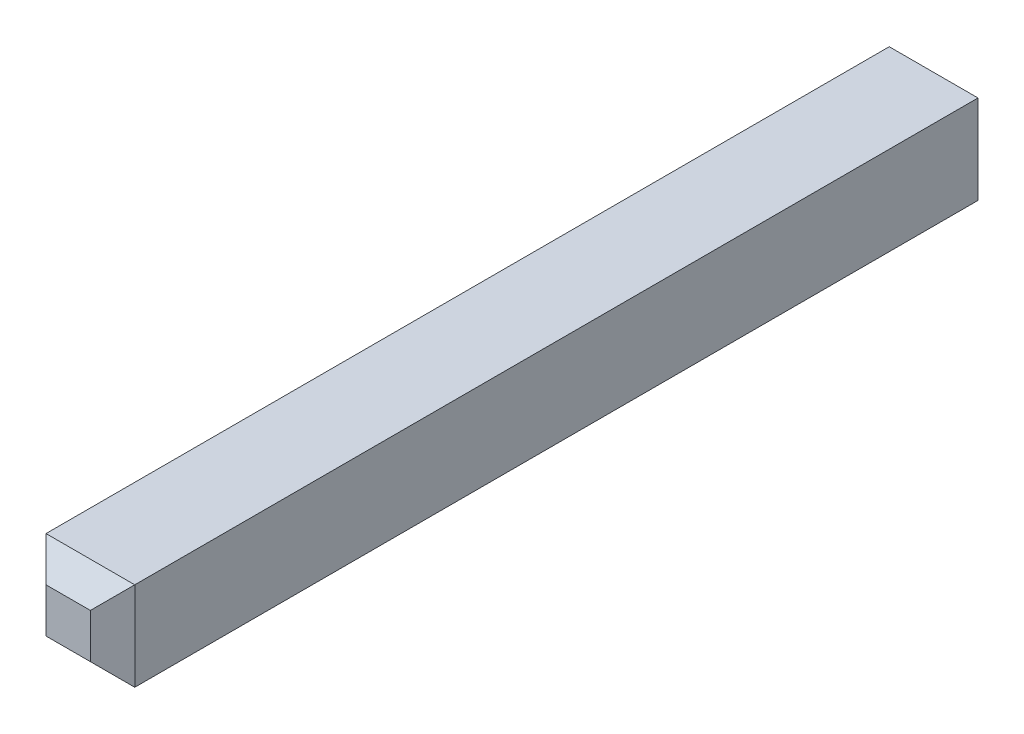
ISO-10303-21;
HEADER;
FILE_DESCRIPTION(('STEP AP214'),'2;1');
FILE_NAME('part.step','',(''),(''),'','','');
FILE_SCHEMA(('AUTOMOTIVE_DESIGN { 1 0 10303 214 1 1 1 1 }'));
ENDSEC;
DATA;
#1=APPLICATION_CONTEXT('core data for automotive mechanical design processes');
#2=APPLICATION_PROTOCOL_DEFINITION('international standard','automotive_design',2000,#1);
#3=PRODUCT_CONTEXT('',#1,'mechanical');
#4=PRODUCT('Part','Part','',(#3));
#5=PRODUCT_RELATED_PRODUCT_CATEGORY('part','',(#4));
#6=PRODUCT_DEFINITION_FORMATION('','',#4);
#7=PRODUCT_DEFINITION_CONTEXT('part definition',#1,'design');
#8=PRODUCT_DEFINITION('design','',#6,#7);
#9=PRODUCT_DEFINITION_SHAPE('','',#8);
#10=(LENGTH_UNIT() NAMED_UNIT(*) SI_UNIT(.MILLI.,.METRE.));
#11=(NAMED_UNIT(*) PLANE_ANGLE_UNIT() SI_UNIT($,.RADIAN.));
#12=(NAMED_UNIT(*) SI_UNIT($,.STERADIAN.) SOLID_ANGLE_UNIT());
#13=UNCERTAINTY_MEASURE_WITH_UNIT(LENGTH_MEASURE(1.E-05),#10,'distance_accuracy_value','');
#14=(GEOMETRIC_REPRESENTATION_CONTEXT(3) GLOBAL_UNCERTAINTY_ASSIGNED_CONTEXT((#13)) GLOBAL_UNIT_ASSIGNED_CONTEXT((#10,
#11,#12)) REPRESENTATION_CONTEXT('',''));
#15=CARTESIAN_POINT('',(0.,0.,0.));
#16=DIRECTION('',(0.,0.,1.));
#17=DIRECTION('',(1.,0.,0.));
#18=AXIS2_PLACEMENT_3D('',#15,#16,#17);
#19=CARTESIAN_POINT('',(0.,0.,40.));
#20=DIRECTION('',(1.,0.,0.));
#21=DIRECTION('',(0.,0.,-1.));
#22=AXIS2_PLACEMENT_3D('',#19,#20,#21);
#23=PLANE('',#22);
#24=DIRECTION('',(0.,0.,-1.));
#25=VECTOR('',#24,1.);
#26=CARTESIAN_POINT('',(0.,4.,40.));
#27=LINE('',#26,#25);
#28=CARTESIAN_POINT('',(0.,4.,39.));
#29=VERTEX_POINT('',#28);
#30=CARTESIAN_POINT('',(0.,4.,0.999999999999994));
#31=VERTEX_POINT('',#30);
#32=EDGE_CURVE('E143',#29,#31,#27,.T.);
#33=ORIENTED_EDGE('',*,*,#32,.T.);
#34=DIRECTION('',(0.,-1.,0.));
#35=VECTOR('',#34,1.);
#36=CARTESIAN_POINT('',(0.,0.,0.999999999999994));
#37=LINE('',#36,#35);
#38=CARTESIAN_POINT('',(0.,0.,0.999999999999994));
#39=VERTEX_POINT('',#38);
#40=EDGE_CURVE('E152',#31,#39,#37,.T.);
#41=ORIENTED_EDGE('',*,*,#40,.T.);
#42=DIRECTION('',(0.,0.,-1.));
#43=VECTOR('',#42,1.);
#44=CARTESIAN_POINT('',(0.,0.,40.));
#45=LINE('',#44,#43);
#46=CARTESIAN_POINT('',(0.,0.,39.));
#47=VERTEX_POINT('',#46);
#48=EDGE_CURVE('E121',#47,#39,#45,.T.);
#49=ORIENTED_EDGE('',*,*,#48,.F.);
#50=DIRECTION('',(0.,1.,0.));
#51=VECTOR('',#50,1.);
#52=CARTESIAN_POINT('',(0.,0.,39.));
#53=LINE('',#52,#51);
#54=EDGE_CURVE('E154',#47,#29,#53,.T.);
#55=ORIENTED_EDGE('',*,*,#54,.T.);
#56=EDGE_LOOP('',(#33,#41,#49,#55));
#57=FACE_BOUND('',#56,.T.);
#58=ADVANCED_FACE('F34',(#57),#23,.F.);
#59=CARTESIAN_POINT('',(0.,0.,40.));
#60=DIRECTION('',(0.,1.,0.));
#61=DIRECTION('',(0.,0.,1.));
#62=AXIS2_PLACEMENT_3D('',#59,#60,#61);
#63=PLANE('',#62);
#64=ORIENTED_EDGE('',*,*,#48,.T.);
#65=DIRECTION('',(1.,0.,0.));
#66=VECTOR('',#65,1.);
#67=CARTESIAN_POINT('',(4.,0.,0.999999999999994));
#68=LINE('',#67,#66);
#69=CARTESIAN_POINT('',(4.,0.,0.999999999999994));
#70=VERTEX_POINT('',#69);
#71=EDGE_CURVE('E120',#39,#70,#68,.T.);
#72=ORIENTED_EDGE('',*,*,#71,.T.);
#73=DIRECTION('',(0.,0.,-1.));
#74=VECTOR('',#73,1.);
#75=CARTESIAN_POINT('',(4.,0.,40.));
#76=LINE('',#75,#74);
#77=CARTESIAN_POINT('',(4.,0.,39.));
#78=VERTEX_POINT('',#77);
#79=EDGE_CURVE('E103',#78,#70,#76,.T.);
#80=ORIENTED_EDGE('',*,*,#79,.F.);
#81=DIRECTION('',(-1.,0.,0.));
#82=VECTOR('',#81,1.);
#83=CARTESIAN_POINT('',(0.,0.,39.));
#84=LINE('',#83,#82);
#85=EDGE_CURVE('E117',#78,#47,#84,.T.);
#86=ORIENTED_EDGE('',*,*,#85,.T.);
#87=EDGE_LOOP('',(#64,#72,#80,#86));
#88=FACE_BOUND('',#87,.T.);
#89=ADVANCED_FACE('F116',(#88),#63,.F.);
#90=CARTESIAN_POINT('',(4.,0.,40.));
#91=DIRECTION('',(-1.,0.,0.));
#92=DIRECTION('',(0.,0.,1.));
#93=AXIS2_PLACEMENT_3D('',#90,#91,#92);
#94=PLANE('',#93);
#95=ORIENTED_EDGE('',*,*,#79,.T.);
#96=DIRECTION('',(0.,1.,0.));
#97=VECTOR('',#96,1.);
#98=CARTESIAN_POINT('',(4.,4.,0.999999999999994));
#99=LINE('',#98,#97);
#100=CARTESIAN_POINT('',(4.,4.,0.999999999999994));
#101=VERTEX_POINT('',#100);
#102=EDGE_CURVE('E109',#70,#101,#99,.T.);
#103=ORIENTED_EDGE('',*,*,#102,.T.);
#104=DIRECTION('',(0.,0.,-1.));
#105=VECTOR('',#104,1.);
#106=CARTESIAN_POINT('',(4.,4.,40.));
#107=LINE('',#106,#105);
#108=CARTESIAN_POINT('',(4.,4.,39.));
#109=VERTEX_POINT('',#108);
#110=EDGE_CURVE('E105',#109,#101,#107,.T.);
#111=ORIENTED_EDGE('',*,*,#110,.F.);
#112=DIRECTION('',(0.,-1.,0.));
#113=VECTOR('',#112,1.);
#114=CARTESIAN_POINT('',(4.,0.,39.));
#115=LINE('',#114,#113);
#116=EDGE_CURVE('E100',#109,#78,#115,.T.);
#117=ORIENTED_EDGE('',*,*,#116,.T.);
#118=EDGE_LOOP('',(#95,#103,#111,#117));
#119=FACE_BOUND('',#118,.T.);
#120=ADVANCED_FACE('F102',(#119),#94,.F.);
#121=CARTESIAN_POINT('',(0.,4.,40.));
#122=DIRECTION('',(0.,-1.,0.));
#123=DIRECTION('',(0.,0.,-1.));
#124=AXIS2_PLACEMENT_3D('',#121,#122,#123);
#125=PLANE('',#124);
#126=ORIENTED_EDGE('',*,*,#110,.T.);
#127=DIRECTION('',(-1.,0.,0.));
#128=VECTOR('',#127,1.);
#129=CARTESIAN_POINT('',(0.,4.,0.999999999999994));
#130=LINE('',#129,#128);
#131=EDGE_CURVE('E156',#101,#31,#130,.T.);
#132=ORIENTED_EDGE('',*,*,#131,.T.);
#133=ORIENTED_EDGE('',*,*,#32,.F.);
#134=DIRECTION('',(1.,0.,0.));
#135=VECTOR('',#134,1.);
#136=CARTESIAN_POINT('',(0.,4.,39.));
#137=LINE('',#136,#135);
#138=EDGE_CURVE('E158',#29,#109,#137,.T.);
#139=ORIENTED_EDGE('',*,*,#138,.T.);
#140=EDGE_LOOP('',(#126,#132,#133,#139));
#141=FACE_BOUND('',#140,.T.);
#142=ADVANCED_FACE('F196',(#141),#125,.F.);
#143=CARTESIAN_POINT('',(0.,0.,40.));
#144=DIRECTION('',(0.,0.,-1.));
#145=DIRECTION('',(-1.,0.,0.));
#146=AXIS2_PLACEMENT_3D('',#143,#144,#145);
#147=PLANE('',#146);
#148=DIRECTION('',(0.,1.,0.));
#149=VECTOR('',#148,1.);
#150=CARTESIAN_POINT('',(3.,0.,40.));
#151=LINE('',#150,#149);
#152=CARTESIAN_POINT('',(3.,0.999999999999997,40.));
#153=VERTEX_POINT('',#152);
#154=CARTESIAN_POINT('',(3.,3.,40.));
#155=VERTEX_POINT('',#154);
#156=EDGE_CURVE('E43',#153,#155,#151,.T.);
#157=ORIENTED_EDGE('',*,*,#156,.T.);
#158=DIRECTION('',(-1.,0.,0.));
#159=VECTOR('',#158,1.);
#160=CARTESIAN_POINT('',(0.,3.,40.));
#161=LINE('',#160,#159);
#162=CARTESIAN_POINT('',(0.999999999999997,3.,40.));
#163=VERTEX_POINT('',#162);
#164=EDGE_CURVE('E11',#155,#163,#161,.T.);
#165=ORIENTED_EDGE('',*,*,#164,.T.);
#166=DIRECTION('',(0.,-1.,0.));
#167=VECTOR('',#166,1.);
#168=CARTESIAN_POINT('',(0.999999999999997,0.,40.));
#169=LINE('',#168,#167);
#170=CARTESIAN_POINT('',(0.999999999999997,0.999999999999997,40.));
#171=VERTEX_POINT('',#170);
#172=EDGE_CURVE('E150',#163,#171,#169,.T.);
#173=ORIENTED_EDGE('',*,*,#172,.T.);
#174=DIRECTION('',(1.,0.,0.));
#175=VECTOR('',#174,1.);
#176=CARTESIAN_POINT('',(0.,0.999999999999997,40.));
#177=LINE('',#176,#175);
#178=EDGE_CURVE('E54',#171,#153,#177,.T.);
#179=ORIENTED_EDGE('',*,*,#178,.T.);
#180=EDGE_LOOP('',(#157,#165,#173,#179));
#181=FACE_BOUND('',#180,.T.);
#182=ADVANCED_FACE('F202',(#181),#147,.F.);
#183=CARTESIAN_POINT('',(0.,0.,0.));
#184=DIRECTION('',(0.,0.,-1.));
#185=DIRECTION('',(-1.,0.,0.));
#186=AXIS2_PLACEMENT_3D('',#183,#184,#185);
#187=PLANE('',#186);
#188=DIRECTION('',(0.,-1.,0.));
#189=VECTOR('',#188,1.);
#190=CARTESIAN_POINT('',(3.,0.,0.));
#191=LINE('',#190,#189);
#192=CARTESIAN_POINT('',(3.,3.,0.));
#193=VERTEX_POINT('',#192);
#194=CARTESIAN_POINT('',(3.,1.,0.));
#195=VERTEX_POINT('',#194);
#196=EDGE_CURVE('E163',#193,#195,#191,.T.);
#197=ORIENTED_EDGE('',*,*,#196,.T.);
#198=DIRECTION('',(-1.,0.,0.));
#199=VECTOR('',#198,1.);
#200=CARTESIAN_POINT('',(0.,1.,0.));
#201=LINE('',#200,#199);
#202=CARTESIAN_POINT('',(1.,1.,0.));
#203=VERTEX_POINT('',#202);
#204=EDGE_CURVE('E110',#195,#203,#201,.T.);
#205=ORIENTED_EDGE('',*,*,#204,.T.);
#206=DIRECTION('',(0.,1.,0.));
#207=VECTOR('',#206,1.);
#208=CARTESIAN_POINT('',(1.,4.,0.));
#209=LINE('',#208,#207);
#210=CARTESIAN_POINT('',(1.,3.,0.));
#211=VERTEX_POINT('',#210);
#212=EDGE_CURVE('E167',#203,#211,#209,.T.);
#213=ORIENTED_EDGE('',*,*,#212,.T.);
#214=DIRECTION('',(1.,0.,0.));
#215=VECTOR('',#214,1.);
#216=CARTESIAN_POINT('',(4.,3.,0.));
#217=LINE('',#216,#215);
#218=EDGE_CURVE('E165',#211,#193,#217,.T.);
#219=ORIENTED_EDGE('',*,*,#218,.T.);
#220=EDGE_LOOP('',(#197,#205,#213,#219));
#221=FACE_BOUND('',#220,.T.);
#222=ADVANCED_FACE('F204',(#221),#187,.T.);
#223=CARTESIAN_POINT('',(0.,4.,0.999999999999994));
#224=DIRECTION('',(0.,0.707106781186544,-0.707106781186551));
#225=DIRECTION('',(1.,0.,0.));
#226=AXIS2_PLACEMENT_3D('',#223,#224,#225);
#227=PLANE('',#226);
#228=DIRECTION('',(-0.577350269189628,-0.577350269189628,-0.577350269189622));
#229=VECTOR('',#228,1.);
#230=CARTESIAN_POINT('',(2.66666666666666,2.66666666666666,-0.333333333333335));
#231=LINE('',#230,#229);
#232=EDGE_CURVE('E144',#193,#101,#231,.F.);
#233=ORIENTED_EDGE('',*,*,#232,.F.);
#234=ORIENTED_EDGE('',*,*,#218,.F.);
#235=DIRECTION('',(0.577350269189628,-0.577350269189628,-0.577350269189622));
#236=VECTOR('',#235,1.);
#237=CARTESIAN_POINT('',(1.33333333333334,2.66666666666666,-0.333333333333335));
#238=LINE('',#237,#236);
#239=EDGE_CURVE('E140',#31,#211,#238,.T.);
#240=ORIENTED_EDGE('',*,*,#239,.F.);
#241=ORIENTED_EDGE('',*,*,#131,.F.);
#242=EDGE_LOOP('',(#233,#234,#240,#241));
#243=FACE_BOUND('',#242,.T.);
#244=ADVANCED_FACE('F183',(#243),#227,.T.);
#245=CARTESIAN_POINT('',(0.,0.,0.999999999999994));
#246=DIRECTION('',(-0.707106781186544,0.,-0.707106781186551));
#247=DIRECTION('',(0.,1.,0.));
#248=AXIS2_PLACEMENT_3D('',#245,#246,#247);
#249=PLANE('',#248);
#250=ORIENTED_EDGE('',*,*,#239,.T.);
#251=ORIENTED_EDGE('',*,*,#212,.F.);
#252=DIRECTION('',(-0.577350269189628,-0.577350269189628,0.577350269189622));
#253=VECTOR('',#252,1.);
#254=CARTESIAN_POINT('',(0.,0.,0.999999999999994));
#255=LINE('',#254,#253);
#256=EDGE_CURVE('E131',#39,#203,#255,.F.);
#257=ORIENTED_EDGE('',*,*,#256,.F.);
#258=ORIENTED_EDGE('',*,*,#40,.F.);
#259=EDGE_LOOP('',(#250,#251,#257,#258));
#260=FACE_BOUND('',#259,.T.);
#261=ADVANCED_FACE('F187',(#260),#249,.T.);
#262=CARTESIAN_POINT('',(4.,0.,0.999999999999994));
#263=DIRECTION('',(0.707106781186544,0.,-0.707106781186551));
#264=DIRECTION('',(0.,-1.,0.));
#265=AXIS2_PLACEMENT_3D('',#262,#263,#264);
#266=PLANE('',#265);
#267=ORIENTED_EDGE('',*,*,#232,.T.);
#268=ORIENTED_EDGE('',*,*,#102,.F.);
#269=DIRECTION('',(-0.577350269189628,0.577350269189628,-0.577350269189622));
#270=VECTOR('',#269,1.);
#271=CARTESIAN_POINT('',(4.,0.,0.999999999999994));
#272=LINE('',#271,#270);
#273=EDGE_CURVE('E130',#195,#70,#272,.F.);
#274=ORIENTED_EDGE('',*,*,#273,.F.);
#275=ORIENTED_EDGE('',*,*,#196,.F.);
#276=EDGE_LOOP('',(#267,#268,#274,#275));
#277=FACE_BOUND('',#276,.T.);
#278=ADVANCED_FACE('F195',(#277),#266,.T.);
#279=CARTESIAN_POINT('',(0.,0.,0.999999999999994));
#280=DIRECTION('',(0.,-0.707106781186544,-0.707106781186551));
#281=DIRECTION('',(-1.,0.,0.));
#282=AXIS2_PLACEMENT_3D('',#279,#280,#281);
#283=PLANE('',#282);
#284=ORIENTED_EDGE('',*,*,#256,.T.);
#285=ORIENTED_EDGE('',*,*,#204,.F.);
#286=ORIENTED_EDGE('',*,*,#273,.T.);
#287=ORIENTED_EDGE('',*,*,#71,.F.);
#288=EDGE_LOOP('',(#284,#285,#286,#287));
#289=FACE_BOUND('',#288,.T.);
#290=ADVANCED_FACE('F190',(#289),#283,.T.);
#291=CARTESIAN_POINT('',(0.,0.999999999999997,40.));
#292=DIRECTION('',(0.,0.707106781186551,-0.707106781186544));
#293=DIRECTION('',(1.,0.,0.));
#294=AXIS2_PLACEMENT_3D('',#291,#292,#293);
#295=PLANE('',#294);
#296=DIRECTION('',(0.577350269189624,0.577350269189624,0.57735026918963));
#297=VECTOR('',#296,1.);
#298=CARTESIAN_POINT('',(0.666666666666667,0.666666666666667,39.6666666666667));
#299=LINE('',#298,#297);
#300=EDGE_CURVE('E126',#47,#171,#299,.T.);
#301=ORIENTED_EDGE('',*,*,#300,.F.);
#302=ORIENTED_EDGE('',*,*,#85,.F.);
#303=DIRECTION('',(-0.577350269189624,0.577350269189624,0.57735026918963));
#304=VECTOR('',#303,1.);
#305=CARTESIAN_POINT('',(2.00000000000001,1.99999999999999,41.));
#306=LINE('',#305,#304);
#307=EDGE_CURVE('E38',#153,#78,#306,.F.);
#308=ORIENTED_EDGE('',*,*,#307,.F.);
#309=ORIENTED_EDGE('',*,*,#178,.F.);
#310=EDGE_LOOP('',(#301,#302,#308,#309));
#311=FACE_BOUND('',#310,.T.);
#312=ADVANCED_FACE('F36',(#311),#295,.F.);
#313=CARTESIAN_POINT('',(3.,0.,40.));
#314=DIRECTION('',(-0.707106781186551,0.,-0.707106781186544));
#315=DIRECTION('',(0.,1.,0.));
#316=AXIS2_PLACEMENT_3D('',#313,#314,#315);
#317=PLANE('',#316);
#318=ORIENTED_EDGE('',*,*,#307,.T.);
#319=ORIENTED_EDGE('',*,*,#116,.F.);
#320=DIRECTION('',(-0.577350269189624,-0.577350269189624,0.57735026918963));
#321=VECTOR('',#320,1.);
#322=CARTESIAN_POINT('',(2.00000000000001,2.00000000000001,41.));
#323=LINE('',#322,#321);
#324=EDGE_CURVE('E133',#155,#109,#323,.F.);
#325=ORIENTED_EDGE('',*,*,#324,.F.);
#326=ORIENTED_EDGE('',*,*,#156,.F.);
#327=EDGE_LOOP('',(#318,#319,#325,#326));
#328=FACE_BOUND('',#327,.T.);
#329=ADVANCED_FACE('F129',(#328),#317,.F.);
#330=CARTESIAN_POINT('',(0.999999999999997,0.,40.));
#331=DIRECTION('',(0.707106781186551,0.,-0.707106781186544));
#332=DIRECTION('',(0.,-1.,0.));
#333=AXIS2_PLACEMENT_3D('',#330,#331,#332);
#334=PLANE('',#333);
#335=ORIENTED_EDGE('',*,*,#300,.T.);
#336=ORIENTED_EDGE('',*,*,#172,.F.);
#337=DIRECTION('',(-0.577350269189624,0.577350269189624,-0.57735026918963));
#338=VECTOR('',#337,1.);
#339=CARTESIAN_POINT('',(1.99999999999999,2.00000000000001,41.));
#340=LINE('',#339,#338);
#341=EDGE_CURVE('E136',#29,#163,#340,.F.);
#342=ORIENTED_EDGE('',*,*,#341,.F.);
#343=ORIENTED_EDGE('',*,*,#54,.F.);
#344=EDGE_LOOP('',(#335,#336,#342,#343));
#345=FACE_BOUND('',#344,.T.);
#346=ADVANCED_FACE('F201',(#345),#334,.F.);
#347=CARTESIAN_POINT('',(0.,3.,40.));
#348=DIRECTION('',(0.,-0.707106781186551,-0.707106781186544));
#349=DIRECTION('',(-1.,0.,0.));
#350=AXIS2_PLACEMENT_3D('',#347,#348,#349);
#351=PLANE('',#350);
#352=ORIENTED_EDGE('',*,*,#324,.T.);
#353=ORIENTED_EDGE('',*,*,#138,.F.);
#354=ORIENTED_EDGE('',*,*,#341,.T.);
#355=ORIENTED_EDGE('',*,*,#164,.F.);
#356=EDGE_LOOP('',(#352,#353,#354,#355));
#357=FACE_BOUND('',#356,.T.);
#358=ADVANCED_FACE('F199',(#357),#351,.F.);
#359=CLOSED_SHELL('',(#58,#89,#120,#142,#182,#222,#244,#261,#278,#290,#312,#329,#346,#358));
#360=MANIFOLD_SOLID_BREP('B2',#359);
#361=ADVANCED_BREP_SHAPE_REPRESENTATION('',(#18,#360),#14);
#362=SHAPE_DEFINITION_REPRESENTATION(#9,#361);
ENDSEC;
END-ISO-10303-21;
